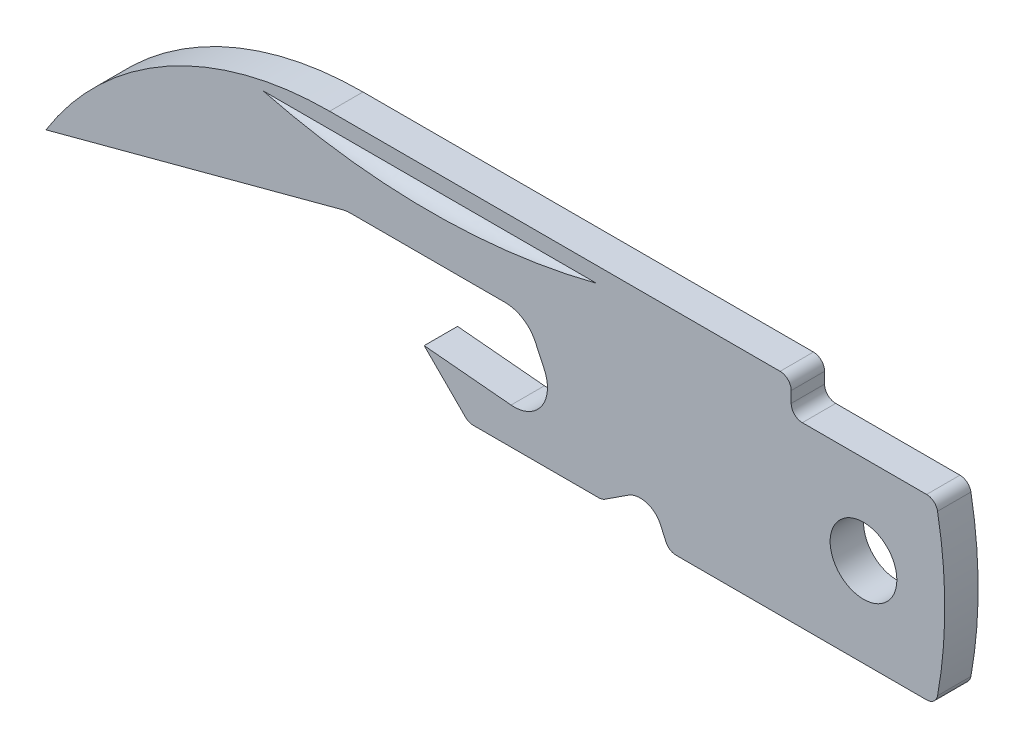
ISO-10303-21;
HEADER;
FILE_DESCRIPTION(('STEP AP214'),'2;1');
FILE_NAME('part.step','',(''),(''),'','','');
FILE_SCHEMA(('AUTOMOTIVE_DESIGN { 1 0 10303 214 1 1 1 1 }'));
ENDSEC;
DATA;
#1=APPLICATION_CONTEXT('core data for automotive mechanical design processes');
#2=APPLICATION_PROTOCOL_DEFINITION('international standard','automotive_design',2000,#1);
#3=PRODUCT_CONTEXT('',#1,'mechanical');
#4=PRODUCT('Part','Part','',(#3));
#5=PRODUCT_RELATED_PRODUCT_CATEGORY('part','',(#4));
#6=PRODUCT_DEFINITION_FORMATION('','',#4);
#7=PRODUCT_DEFINITION_CONTEXT('part definition',#1,'design');
#8=PRODUCT_DEFINITION('design','',#6,#7);
#9=PRODUCT_DEFINITION_SHAPE('','',#8);
#10=(LENGTH_UNIT() NAMED_UNIT(*) SI_UNIT(.MILLI.,.METRE.));
#11=(NAMED_UNIT(*) PLANE_ANGLE_UNIT() SI_UNIT($,.RADIAN.));
#12=(NAMED_UNIT(*) SI_UNIT($,.STERADIAN.) SOLID_ANGLE_UNIT());
#13=UNCERTAINTY_MEASURE_WITH_UNIT(LENGTH_MEASURE(1.E-05),#10,'distance_accuracy_value','');
#14=(GEOMETRIC_REPRESENTATION_CONTEXT(3) GLOBAL_UNCERTAINTY_ASSIGNED_CONTEXT((#13)) GLOBAL_UNIT_ASSIGNED_CONTEXT((#10,
#11,#12)) REPRESENTATION_CONTEXT('',''));
#15=CARTESIAN_POINT('',(0.,0.,0.));
#16=DIRECTION('',(0.,0.,1.));
#17=DIRECTION('',(1.,0.,0.));
#18=AXIS2_PLACEMENT_3D('',#15,#16,#17);
#19=CARTESIAN_POINT('',(-16.3459179422654,0.,0.75));
#20=DIRECTION('',(0.,0.,-1.));
#21=DIRECTION('',(-1.,0.,0.));
#22=AXIS2_PLACEMENT_3D('',#19,#20,#21);
#23=PLANE('',#22);
#24=DIRECTION('',(-1.,0.,0.));
#25=VECTOR('',#24,1.);
#26=CARTESIAN_POINT('',(-27.,4.8,0.75));
#27=LINE('',#26,#25);
#28=CARTESIAN_POINT('',(-12.,4.8,0.75));
#29=VERTEX_POINT('',#28);
#30=CARTESIAN_POINT('',(-27.,4.8,0.75));
#31=VERTEX_POINT('',#30);
#32=EDGE_CURVE('E211',#29,#31,#27,.T.);
#33=ORIENTED_EDGE('',*,*,#32,.F.);
#34=CARTESIAN_POINT('',(-19.5,33.8473750965556,0.75));
#35=DIRECTION('',(0.,0.,1.));
#36=DIRECTION('',(-1.,0.,0.));
#37=AXIS2_PLACEMENT_3D('',#34,#35,#36);
#38=CIRCLE('',#37,30.);
#39=EDGE_CURVE('E219',#31,#29,#38,.T.);
#40=ORIENTED_EDGE('',*,*,#39,.F.);
#41=EDGE_LOOP('',(#33,#40));
#42=FACE_BOUND('',#41,.T.);
#43=DIRECTION('',(0.707106781186547,-0.707106781186548,0.));
#44=VECTOR('',#43,1.);
#45=CARTESIAN_POINT('',(-19.75,-1.5,0.75));
#46=LINE('',#45,#44);
#47=CARTESIAN_POINT('',(-19.75,-1.5,0.75));
#48=VERTEX_POINT('',#47);
#49=CARTESIAN_POINT('',(-17.8964466094067,-3.35355339059327,0.75));
#50=VERTEX_POINT('',#49);
#51=EDGE_CURVE('E237',#48,#50,#46,.T.);
#52=ORIENTED_EDGE('',*,*,#51,.T.);
#53=CARTESIAN_POINT('',(-17.5428932188135,-3.,0.75));
#54=DIRECTION('',(0.,0.,-1.));
#55=DIRECTION('',(-1.,0.,0.));
#56=AXIS2_PLACEMENT_3D('',#53,#54,#55);
#57=CIRCLE('',#56,0.5);
#58=CARTESIAN_POINT('',(-17.5428932188135,-3.5,0.75));
#59=VERTEX_POINT('',#58);
#60=EDGE_CURVE('E352',#50,#59,#57,.F.);
#61=ORIENTED_EDGE('',*,*,#60,.T.);
#62=DIRECTION('',(1.,0.,0.));
#63=VECTOR('',#62,1.);
#64=CARTESIAN_POINT('',(-17.75,-3.5,0.75));
#65=LINE('',#64,#63);
#66=CARTESIAN_POINT('',(-11.8984422579048,-3.5,0.75));
#67=VERTEX_POINT('',#66);
#68=EDGE_CURVE('E240',#59,#67,#65,.T.);
#69=ORIENTED_EDGE('',*,*,#68,.T.);
#70=CARTESIAN_POINT('',(-11.8984422579048,-3.,0.75));
#71=DIRECTION('',(0.,0.,-1.));
#72=DIRECTION('',(-1.,0.,0.));
#73=AXIS2_PLACEMENT_3D('',#70,#71,#72);
#74=CIRCLE('',#73,0.5);
#75=CARTESIAN_POINT('',(-11.6256056721861,-3.41899904235375,0.75));
#76=VERTEX_POINT('',#75);
#77=EDGE_CURVE('E342',#67,#76,#74,.F.);
#78=ORIENTED_EDGE('',*,*,#77,.T.);
#79=DIRECTION('',(0.837998084707486,0.545673171437432,0.));
#80=VECTOR('',#79,1.);
#81=CARTESIAN_POINT('',(-11.75,-3.5,0.75));
#82=LINE('',#81,#80);
#83=CARTESIAN_POINT('',(-10.5806227373016,-2.73854503824294,0.75));
#84=VERTEX_POINT('',#83);
#85=EDGE_CURVE('E243',#76,#84,#82,.T.);
#86=ORIENTED_EDGE('',*,*,#85,.T.);
#87=CARTESIAN_POINT('',(-10.0349495658642,-3.57654312295042,0.75));
#88=DIRECTION('',(0.,0.,-1.));
#89=DIRECTION('',(-1.,0.,0.));
#90=AXIS2_PLACEMENT_3D('',#87,#88,#89);
#91=CIRCLE('',#90,1.);
#92=CARTESIAN_POINT('',(-9.12213131396929,-3.16817706289217,0.75));
#93=VERTEX_POINT('',#92);
#94=EDGE_CURVE('E321',#84,#93,#91,.T.);
#95=ORIENTED_EDGE('',*,*,#94,.T.);
#96=DIRECTION('',(0.408366060058254,-0.91281825189492,0.));
#97=VECTOR('',#96,1.);
#98=CARTESIAN_POINT('',(-8.75,-4.,0.75));
#99=LINE('',#98,#97);
#100=CARTESIAN_POINT('',(-8.88233917077645,-3.70418303002913,0.75));
#101=VERTEX_POINT('',#100);
#102=EDGE_CURVE('E285',#93,#101,#99,.T.);
#103=ORIENTED_EDGE('',*,*,#102,.T.);
#104=CARTESIAN_POINT('',(-8.42593004482898,-3.5,0.75));
#105=DIRECTION('',(0.,0.,-1.));
#106=DIRECTION('',(-1.,0.,0.));
#107=AXIS2_PLACEMENT_3D('',#104,#105,#106);
#108=CIRCLE('',#107,0.5);
#109=CARTESIAN_POINT('',(-8.42593004482898,-4.,0.75));
#110=VERTEX_POINT('',#109);
#111=EDGE_CURVE('E344',#101,#110,#108,.F.);
#112=ORIENTED_EDGE('',*,*,#111,.T.);
#113=DIRECTION('',(1.,0.,0.));
#114=VECTOR('',#113,1.);
#115=CARTESIAN_POINT('',(3.25,-4.,0.75));
#116=LINE('',#115,#114);
#117=CARTESIAN_POINT('',(2.83740815098545,-4.,0.75));
#118=VERTEX_POINT('',#117);
#119=EDGE_CURVE('E288',#110,#118,#116,.T.);
#120=ORIENTED_EDGE('',*,*,#119,.T.);
#121=CARTESIAN_POINT('',(2.83740815098545,-3.5,0.75));
#122=DIRECTION('',(0.,0.,-1.));
#123=DIRECTION('',(-1.,0.,0.));
#124=AXIS2_PLACEMENT_3D('',#121,#122,#123);
#125=CIRCLE('',#124,0.5);
#126=CARTESIAN_POINT('',(3.32928830722265,-3.58974358974359,0.75));
#127=VERTEX_POINT('',#126);
#128=EDGE_CURVE('E346',#118,#127,#125,.F.);
#129=ORIENTED_EDGE('',*,*,#128,.T.);
#130=CARTESIAN_POINT('',(-16.3459179422654,0.,0.75));
#131=DIRECTION('',(0.,0.,1.));
#132=DIRECTION('',(-1.,0.,0.));
#133=AXIS2_PLACEMENT_3D('',#130,#131,#132);
#134=CIRCLE('',#133,20.);
#135=CARTESIAN_POINT('',(3.32928830722265,3.58974358974359,0.75));
#136=VERTEX_POINT('',#135);
#137=EDGE_CURVE('E291',#127,#136,#134,.T.);
#138=ORIENTED_EDGE('',*,*,#137,.T.);
#139=CARTESIAN_POINT('',(2.83740815098545,3.5,0.75));
#140=DIRECTION('',(0.,0.,-1.));
#141=DIRECTION('',(-1.,0.,0.));
#142=AXIS2_PLACEMENT_3D('',#139,#140,#141);
#143=CIRCLE('',#142,0.5);
#144=CARTESIAN_POINT('',(2.83740815098545,4.,0.75));
#145=VERTEX_POINT('',#144);
#146=EDGE_CURVE('E348',#136,#145,#143,.F.);
#147=ORIENTED_EDGE('',*,*,#146,.T.);
#148=DIRECTION('',(-1.,0.,0.));
#149=VECTOR('',#148,1.);
#150=CARTESIAN_POINT('',(-3.25,4.,0.75));
#151=LINE('',#150,#149);
#152=CARTESIAN_POINT('',(-2.75,4.,0.75));
#153=VERTEX_POINT('',#152);
#154=EDGE_CURVE('E294',#145,#153,#151,.T.);
#155=ORIENTED_EDGE('',*,*,#154,.T.);
#156=CARTESIAN_POINT('',(-2.75,4.5,0.75));
#157=DIRECTION('',(0.,0.,-1.));
#158=DIRECTION('',(-1.,0.,0.));
#159=AXIS2_PLACEMENT_3D('',#156,#157,#158);
#160=CIRCLE('',#159,0.5);
#161=CARTESIAN_POINT('',(-3.25,4.5,0.75));
#162=VERTEX_POINT('',#161);
#163=EDGE_CURVE('E384',#153,#162,#160,.T.);
#164=ORIENTED_EDGE('',*,*,#163,.T.);
#165=DIRECTION('',(0.,1.,0.));
#166=VECTOR('',#165,1.);
#167=CARTESIAN_POINT('',(-3.25,5.5,0.75));
#168=LINE('',#167,#166);
#169=CARTESIAN_POINT('',(-3.25,5.,0.75));
#170=VERTEX_POINT('',#169);
#171=EDGE_CURVE('E279',#162,#170,#168,.T.);
#172=ORIENTED_EDGE('',*,*,#171,.T.);
#173=CARTESIAN_POINT('',(-3.75,5.,0.75));
#174=DIRECTION('',(0.,0.,-1.));
#175=DIRECTION('',(-1.,0.,0.));
#176=AXIS2_PLACEMENT_3D('',#173,#174,#175);
#177=CIRCLE('',#176,0.5);
#178=CARTESIAN_POINT('',(-3.75,5.5,0.75));
#179=VERTEX_POINT('',#178);
#180=EDGE_CURVE('E350',#170,#179,#177,.F.);
#181=ORIENTED_EDGE('',*,*,#180,.T.);
#182=DIRECTION('',(-1.,0.,0.));
#183=VECTOR('',#182,1.);
#184=CARTESIAN_POINT('',(-13.,5.5,0.75));
#185=LINE('',#184,#183);
#186=CARTESIAN_POINT('',(-24.,5.5,0.75));
#187=VERTEX_POINT('',#186);
#188=EDGE_CURVE('E282',#179,#187,#185,.T.);
#189=ORIENTED_EDGE('',*,*,#188,.T.);
#190=CARTESIAN_POINT('',(-24.,-9.5,0.75));
#191=DIRECTION('',(0.,0.,1.));
#192=DIRECTION('',(1.,0.,0.));
#193=AXIS2_PLACEMENT_3D('',#190,#191,#192);
#194=CIRCLE('',#193,15.);
#195=CARTESIAN_POINT('',(-36.751078385768,-1.6,0.75));
#196=VERTEX_POINT('',#195);
#197=EDGE_CURVE('E224',#187,#196,#194,.T.);
#198=ORIENTED_EDGE('',*,*,#197,.T.);
#199=DIRECTION('',(0.966240063227901,0.25764343619301,0.));
#200=VECTOR('',#199,1.);
#201=CARTESIAN_POINT('',(-36.751078385768,-1.6,0.75));
#202=LINE('',#201,#200);
#203=CARTESIAN_POINT('',(-23.4399148136078,1.94936009484185,0.75));
#204=VERTEX_POINT('',#203);
#205=EDGE_CURVE('E226',#196,#204,#202,.T.);
#206=ORIENTED_EDGE('',*,*,#205,.T.);
#207=CARTESIAN_POINT('',(-23.0534496593183,0.499999999999998,0.75));
#208=DIRECTION('',(0.,0.,-1.));
#209=DIRECTION('',(-1.,0.,0.));
#210=AXIS2_PLACEMENT_3D('',#207,#208,#209);
#211=CIRCLE('',#210,1.5);
#212=CARTESIAN_POINT('',(-23.0534496593183,2.,0.75));
#213=VERTEX_POINT('',#212);
#214=EDGE_CURVE('E406',#204,#213,#211,.T.);
#215=ORIENTED_EDGE('',*,*,#214,.T.);
#216=DIRECTION('',(1.,0.,0.));
#217=VECTOR('',#216,1.);
#218=CARTESIAN_POINT('',(-23.25,2.,0.75));
#219=LINE('',#218,#217);
#220=CARTESIAN_POINT('',(-16.1081156381993,2.,0.75));
#221=VERTEX_POINT('',#220);
#222=EDGE_CURVE('E229',#213,#221,#219,.T.);
#223=ORIENTED_EDGE('',*,*,#222,.T.);
#224=CARTESIAN_POINT('',(-16.1081156381993,0.499999999999998,0.75));
#225=DIRECTION('',(0.,0.,-1.));
#226=DIRECTION('',(-1.,0.,0.));
#227=AXIS2_PLACEMENT_3D('',#224,#225,#226);
#228=CIRCLE('',#227,1.5);
#229=CARTESIAN_POINT('',(-14.7471497283986,1.13069151917592,0.75));
#230=VERTEX_POINT('',#229);
#231=EDGE_CURVE('E11',#221,#230,#228,.T.);
#232=ORIENTED_EDGE('',*,*,#231,.T.);
#233=DIRECTION('',(0.420461012783947,-0.907310606533781,0.));
#234=VECTOR('',#233,1.);
#235=CARTESIAN_POINT('',(-15.15,2.,0.75));
#236=LINE('',#235,#234);
#237=CARTESIAN_POINT('',(-14.3454252084757,0.263812291973821,0.75));
#238=VERTEX_POINT('',#237);
#239=EDGE_CURVE('E232',#230,#238,#236,.T.);
#240=ORIENTED_EDGE('',*,*,#239,.T.);
#241=CARTESIAN_POINT('',(-15.7063911182763,-0.3668792272021,0.75));
#242=DIRECTION('',(0.,0.,-1.));
#243=DIRECTION('',(-1.,0.,0.));
#244=AXIS2_PLACEMENT_3D('',#241,#242,#243);
#245=CIRCLE('',#244,1.5);
#246=CARTESIAN_POINT('',(-15.8442665046019,-1.86052924572906,0.75));
#247=VERTEX_POINT('',#246);
#248=EDGE_CURVE('E402',#238,#247,#245,.T.);
#249=ORIENTED_EDGE('',*,*,#248,.T.);
#250=DIRECTION('',(-0.995766679017971,0.0919169242170434,0.));
#251=VECTOR('',#250,1.);
#252=CARTESIAN_POINT('',(-13.25,-2.1,0.75));
#253=LINE('',#252,#251);
#254=EDGE_CURVE('E235',#247,#48,#253,.T.);
#255=ORIENTED_EDGE('',*,*,#254,.T.);
#256=EDGE_LOOP('',(#52,#61,#69,#78,#86,#95,#103,#112,#120,#129,#138,#147,#155,#164,#172,#181,
#189,#198,#206,#215,#223,#232,#240,#249,#255));
#257=FACE_BOUND('',#256,.T.);
#258=CARTESIAN_POINT('',(0.,0.,0.75));
#259=DIRECTION('',(0.,0.,1.));
#260=DIRECTION('',(1.,0.,0.));
#261=AXIS2_PLACEMENT_3D('',#258,#259,#260);
#262=CIRCLE('',#261,1.5);
#263=CARTESIAN_POINT('',(1.5,0.,0.75));
#264=VERTEX_POINT('',#263);
#265=EDGE_CURVE('E273',#264,#264,#262,.T.);
#266=ORIENTED_EDGE('',*,*,#265,.F.);
#267=EDGE_LOOP('',(#266));
#268=FACE_BOUND('',#267,.T.);
#269=ADVANCED_FACE('F39',(#42,#257,#268),#23,.F.);
#270=CARTESIAN_POINT('',(-16.3459179422654,0.,-0.75));
#271=DIRECTION('',(0.,0.,-1.));
#272=DIRECTION('',(-1.,0.,0.));
#273=AXIS2_PLACEMENT_3D('',#270,#271,#272);
#274=PLANE('',#273);
#275=DIRECTION('',(1.,0.,0.));
#276=VECTOR('',#275,1.);
#277=CARTESIAN_POINT('',(-17.75,-3.5,-0.75));
#278=LINE('',#277,#276);
#279=CARTESIAN_POINT('',(-17.5428932188135,-3.5,-0.75));
#280=VERTEX_POINT('',#279);
#281=CARTESIAN_POINT('',(-11.8984422579048,-3.5,-0.75));
#282=VERTEX_POINT('',#281);
#283=EDGE_CURVE('E260',#280,#282,#278,.T.);
#284=ORIENTED_EDGE('',*,*,#283,.F.);
#285=CARTESIAN_POINT('',(-17.5428932188135,-3.,-0.75));
#286=DIRECTION('',(0.,0.,-1.));
#287=DIRECTION('',(-1.,0.,0.));
#288=AXIS2_PLACEMENT_3D('',#285,#286,#287);
#289=CIRCLE('',#288,0.5);
#290=CARTESIAN_POINT('',(-17.8964466094067,-3.35355339059327,-0.75));
#291=VERTEX_POINT('',#290);
#292=EDGE_CURVE('E338',#280,#291,#289,.T.);
#293=ORIENTED_EDGE('',*,*,#292,.T.);
#294=DIRECTION('',(0.707106781186547,-0.707106781186548,0.));
#295=VECTOR('',#294,1.);
#296=CARTESIAN_POINT('',(-19.75,-1.5,-0.75));
#297=LINE('',#296,#295);
#298=CARTESIAN_POINT('',(-19.75,-1.5,-0.75));
#299=VERTEX_POINT('',#298);
#300=EDGE_CURVE('E257',#299,#291,#297,.T.);
#301=ORIENTED_EDGE('',*,*,#300,.F.);
#302=DIRECTION('',(-0.995766679017971,0.0919169242170434,0.));
#303=VECTOR('',#302,1.);
#304=CARTESIAN_POINT('',(-13.25,-2.1,-0.75));
#305=LINE('',#304,#303);
#306=CARTESIAN_POINT('',(-15.8442665046019,-1.86052924572906,-0.75));
#307=VERTEX_POINT('',#306);
#308=EDGE_CURVE('E255',#307,#299,#305,.T.);
#309=ORIENTED_EDGE('',*,*,#308,.F.);
#310=CARTESIAN_POINT('',(-15.7063911182763,-0.3668792272021,-0.75));
#311=DIRECTION('',(0.,0.,-1.));
#312=DIRECTION('',(-1.,0.,0.));
#313=AXIS2_PLACEMENT_3D('',#310,#311,#312);
#314=CIRCLE('',#313,1.5);
#315=CARTESIAN_POINT('',(-14.3454252084757,0.263812291973821,-0.75));
#316=VERTEX_POINT('',#315);
#317=EDGE_CURVE('E400',#307,#316,#314,.F.);
#318=ORIENTED_EDGE('',*,*,#317,.T.);
#319=DIRECTION('',(0.420461012783947,-0.907310606533781,0.));
#320=VECTOR('',#319,1.);
#321=CARTESIAN_POINT('',(-15.15,2.,-0.75));
#322=LINE('',#321,#320);
#323=CARTESIAN_POINT('',(-14.7471497283986,1.13069151917592,-0.75));
#324=VERTEX_POINT('',#323);
#325=EDGE_CURVE('E252',#324,#316,#322,.T.);
#326=ORIENTED_EDGE('',*,*,#325,.F.);
#327=CARTESIAN_POINT('',(-16.1081156381993,0.499999999999998,-0.75));
#328=DIRECTION('',(0.,0.,-1.));
#329=DIRECTION('',(-1.,0.,0.));
#330=AXIS2_PLACEMENT_3D('',#327,#328,#329);
#331=CIRCLE('',#330,1.5);
#332=CARTESIAN_POINT('',(-16.1081156381993,2.,-0.75));
#333=VERTEX_POINT('',#332);
#334=EDGE_CURVE('E47',#324,#333,#331,.F.);
#335=ORIENTED_EDGE('',*,*,#334,.T.);
#336=DIRECTION('',(1.,0.,0.));
#337=VECTOR('',#336,1.);
#338=CARTESIAN_POINT('',(-23.25,2.,-0.75));
#339=LINE('',#338,#337);
#340=CARTESIAN_POINT('',(-23.0534496593183,2.,-0.75));
#341=VERTEX_POINT('',#340);
#342=EDGE_CURVE('E249',#341,#333,#339,.T.);
#343=ORIENTED_EDGE('',*,*,#342,.F.);
#344=CARTESIAN_POINT('',(-23.0534496593183,0.499999999999998,-0.75));
#345=DIRECTION('',(0.,0.,-1.));
#346=DIRECTION('',(-1.,0.,0.));
#347=AXIS2_PLACEMENT_3D('',#344,#345,#346);
#348=CIRCLE('',#347,1.5);
#349=CARTESIAN_POINT('',(-23.4399148136078,1.94936009484185,-0.75));
#350=VERTEX_POINT('',#349);
#351=EDGE_CURVE('E404',#341,#350,#348,.F.);
#352=ORIENTED_EDGE('',*,*,#351,.T.);
#353=DIRECTION('',(0.966240063227901,0.25764343619301,0.));
#354=VECTOR('',#353,1.);
#355=CARTESIAN_POINT('',(-36.751078385768,-1.6,-0.75));
#356=LINE('',#355,#354);
#357=CARTESIAN_POINT('',(-36.751078385768,-1.6,-0.75));
#358=VERTEX_POINT('',#357);
#359=EDGE_CURVE('E247',#358,#350,#356,.T.);
#360=ORIENTED_EDGE('',*,*,#359,.F.);
#361=CARTESIAN_POINT('',(-24.,-9.5,-0.75));
#362=DIRECTION('',(0.,0.,1.));
#363=DIRECTION('',(1.,0.,0.));
#364=AXIS2_PLACEMENT_3D('',#361,#362,#363);
#365=CIRCLE('',#364,15.);
#366=CARTESIAN_POINT('',(-24.,5.5,-0.75));
#367=VERTEX_POINT('',#366);
#368=EDGE_CURVE('E215',#367,#358,#365,.T.);
#369=ORIENTED_EDGE('',*,*,#368,.F.);
#370=DIRECTION('',(-1.,0.,0.));
#371=VECTOR('',#370,1.);
#372=CARTESIAN_POINT('',(-13.,5.5,-0.75));
#373=LINE('',#372,#371);
#374=CARTESIAN_POINT('',(-3.75,5.5,-0.75));
#375=VERTEX_POINT('',#374);
#376=EDGE_CURVE('E300',#375,#367,#373,.T.);
#377=ORIENTED_EDGE('',*,*,#376,.F.);
#378=CARTESIAN_POINT('',(-3.75,5.,-0.75));
#379=DIRECTION('',(0.,0.,-1.));
#380=DIRECTION('',(-1.,0.,0.));
#381=AXIS2_PLACEMENT_3D('',#378,#379,#380);
#382=CIRCLE('',#381,0.5);
#383=CARTESIAN_POINT('',(-3.25,5.,-0.75));
#384=VERTEX_POINT('',#383);
#385=EDGE_CURVE('E336',#375,#384,#382,.T.);
#386=ORIENTED_EDGE('',*,*,#385,.T.);
#387=DIRECTION('',(0.,1.,0.));
#388=VECTOR('',#387,1.);
#389=CARTESIAN_POINT('',(-3.25,5.5,-0.75));
#390=LINE('',#389,#388);
#391=CARTESIAN_POINT('',(-3.25,4.5,-0.75));
#392=VERTEX_POINT('',#391);
#393=EDGE_CURVE('E276',#392,#384,#390,.T.);
#394=ORIENTED_EDGE('',*,*,#393,.F.);
#395=CARTESIAN_POINT('',(-2.75,4.5,-0.75));
#396=DIRECTION('',(0.,0.,-1.));
#397=DIRECTION('',(-1.,0.,0.));
#398=AXIS2_PLACEMENT_3D('',#395,#396,#397);
#399=CIRCLE('',#398,0.5);
#400=CARTESIAN_POINT('',(-2.75,4.,-0.75));
#401=VERTEX_POINT('',#400);
#402=EDGE_CURVE('E382',#392,#401,#399,.F.);
#403=ORIENTED_EDGE('',*,*,#402,.T.);
#404=DIRECTION('',(-1.,0.,0.));
#405=VECTOR('',#404,1.);
#406=CARTESIAN_POINT('',(-3.25,4.,-0.75));
#407=LINE('',#406,#405);
#408=CARTESIAN_POINT('',(2.83740815098545,4.,-0.75));
#409=VERTEX_POINT('',#408);
#410=EDGE_CURVE('E283',#409,#401,#407,.T.);
#411=ORIENTED_EDGE('',*,*,#410,.F.);
#412=CARTESIAN_POINT('',(2.83740815098545,3.5,-0.75));
#413=DIRECTION('',(0.,0.,-1.));
#414=DIRECTION('',(-1.,0.,0.));
#415=AXIS2_PLACEMENT_3D('',#412,#413,#414);
#416=CIRCLE('',#415,0.5);
#417=CARTESIAN_POINT('',(3.32928830722265,3.58974358974359,-0.75));
#418=VERTEX_POINT('',#417);
#419=EDGE_CURVE('E334',#409,#418,#416,.T.);
#420=ORIENTED_EDGE('',*,*,#419,.T.);
#421=CARTESIAN_POINT('',(-16.3459179422654,0.,-0.75));
#422=DIRECTION('',(0.,0.,1.));
#423=DIRECTION('',(-1.,0.,0.));
#424=AXIS2_PLACEMENT_3D('',#421,#422,#423);
#425=CIRCLE('',#424,20.);
#426=CARTESIAN_POINT('',(3.32928830722265,-3.58974358974359,-0.75));
#427=VERTEX_POINT('',#426);
#428=EDGE_CURVE('E308',#427,#418,#425,.T.);
#429=ORIENTED_EDGE('',*,*,#428,.F.);
#430=CARTESIAN_POINT('',(2.83740815098545,-3.5,-0.75));
#431=DIRECTION('',(0.,0.,-1.));
#432=DIRECTION('',(-1.,0.,0.));
#433=AXIS2_PLACEMENT_3D('',#430,#431,#432);
#434=CIRCLE('',#433,0.5);
#435=CARTESIAN_POINT('',(2.83740815098545,-4.,-0.75));
#436=VERTEX_POINT('',#435);
#437=EDGE_CURVE('E332',#427,#436,#434,.T.);
#438=ORIENTED_EDGE('',*,*,#437,.T.);
#439=DIRECTION('',(1.,0.,0.));
#440=VECTOR('',#439,1.);
#441=CARTESIAN_POINT('',(3.25,-4.,-0.75));
#442=LINE('',#441,#440);
#443=CARTESIAN_POINT('',(-8.42593004482898,-4.,-0.75));
#444=VERTEX_POINT('',#443);
#445=EDGE_CURVE('E305',#444,#436,#442,.T.);
#446=ORIENTED_EDGE('',*,*,#445,.F.);
#447=CARTESIAN_POINT('',(-8.42593004482898,-3.5,-0.75));
#448=DIRECTION('',(0.,0.,-1.));
#449=DIRECTION('',(-1.,0.,0.));
#450=AXIS2_PLACEMENT_3D('',#447,#448,#449);
#451=CIRCLE('',#450,0.5);
#452=CARTESIAN_POINT('',(-8.88233917077645,-3.70418303002913,-0.75));
#453=VERTEX_POINT('',#452);
#454=EDGE_CURVE('E330',#444,#453,#451,.T.);
#455=ORIENTED_EDGE('',*,*,#454,.T.);
#456=DIRECTION('',(0.408366060058254,-0.91281825189492,0.));
#457=VECTOR('',#456,1.);
#458=CARTESIAN_POINT('',(-8.75,-4.,-0.75));
#459=LINE('',#458,#457);
#460=CARTESIAN_POINT('',(-9.12213131396929,-3.16817706289217,-0.75));
#461=VERTEX_POINT('',#460);
#462=EDGE_CURVE('E302',#461,#453,#459,.T.);
#463=ORIENTED_EDGE('',*,*,#462,.F.);
#464=CARTESIAN_POINT('',(-10.0349495658642,-3.57654312295042,-0.75));
#465=DIRECTION('',(0.,0.,-1.));
#466=DIRECTION('',(-1.,0.,0.));
#467=AXIS2_PLACEMENT_3D('',#464,#465,#466);
#468=CIRCLE('',#467,1.);
#469=CARTESIAN_POINT('',(-10.5806227373016,-2.73854503824294,-0.75));
#470=VERTEX_POINT('',#469);
#471=EDGE_CURVE('E318',#461,#470,#468,.F.);
#472=ORIENTED_EDGE('',*,*,#471,.T.);
#473=DIRECTION('',(0.837998084707486,0.545673171437432,0.));
#474=VECTOR('',#473,1.);
#475=CARTESIAN_POINT('',(-11.75,-3.5,-0.75));
#476=LINE('',#475,#474);
#477=CARTESIAN_POINT('',(-11.6256056721861,-3.41899904235375,-0.75));
#478=VERTEX_POINT('',#477);
#479=EDGE_CURVE('E227',#478,#470,#476,.T.);
#480=ORIENTED_EDGE('',*,*,#479,.F.);
#481=CARTESIAN_POINT('',(-11.8984422579048,-3.,-0.75));
#482=DIRECTION('',(0.,0.,-1.));
#483=DIRECTION('',(-1.,0.,0.));
#484=AXIS2_PLACEMENT_3D('',#481,#482,#483);
#485=CIRCLE('',#484,0.5);
#486=EDGE_CURVE('E328',#478,#282,#485,.T.);
#487=ORIENTED_EDGE('',*,*,#486,.T.);
#488=EDGE_LOOP('',(#284,#293,#301,#309,#318,#326,#335,#343,#352,#360,#369,#377,#386,#394,#403,
#411,#420,#429,#438,#446,#455,#463,#472,#480,#487));
#489=FACE_BOUND('',#488,.T.);
#490=CARTESIAN_POINT('',(0.,0.,-0.75));
#491=DIRECTION('',(0.,0.,1.));
#492=DIRECTION('',(1.,0.,0.));
#493=AXIS2_PLACEMENT_3D('',#490,#491,#492);
#494=CIRCLE('',#493,1.5);
#495=CARTESIAN_POINT('',(1.5,0.,-0.75));
#496=VERTEX_POINT('',#495);
#497=EDGE_CURVE('E272',#496,#496,#494,.T.);
#498=ORIENTED_EDGE('',*,*,#497,.T.);
#499=EDGE_LOOP('',(#498));
#500=FACE_BOUND('',#499,.T.);
#501=ADVANCED_FACE('F411',(#489,#500),#274,.T.);
#502=CARTESIAN_POINT('',(-3.25,5.5,0.75));
#503=DIRECTION('',(-1.,0.,0.));
#504=DIRECTION('',(0.,-1.,0.));
#505=AXIS2_PLACEMENT_3D('',#502,#503,#504);
#506=PLANE('',#505);
#507=ORIENTED_EDGE('',*,*,#393,.T.);
#508=DIRECTION('',(0.,0.,-1.));
#509=VECTOR('',#508,1.);
#510=CARTESIAN_POINT('',(-3.25,5.,0.75));
#511=LINE('',#510,#509);
#512=EDGE_CURVE('E360',#384,#170,#511,.F.);
#513=ORIENTED_EDGE('',*,*,#512,.T.);
#514=ORIENTED_EDGE('',*,*,#171,.F.);
#515=DIRECTION('',(0.,0.,-1.));
#516=VECTOR('',#515,1.);
#517=CARTESIAN_POINT('',(-3.25,4.5,-0.75));
#518=LINE('',#517,#516);
#519=EDGE_CURVE('E357',#162,#392,#518,.T.);
#520=ORIENTED_EDGE('',*,*,#519,.T.);
#521=EDGE_LOOP('',(#507,#513,#514,#520));
#522=FACE_BOUND('',#521,.T.);
#523=ADVANCED_FACE('F500',(#522),#506,.F.);
#524=CARTESIAN_POINT('',(-13.,5.5,0.75));
#525=DIRECTION('',(0.,-1.,0.));
#526=DIRECTION('',(0.,0.,-1.));
#527=AXIS2_PLACEMENT_3D('',#524,#525,#526);
#528=PLANE('',#527);
#529=ORIENTED_EDGE('',*,*,#188,.F.);
#530=DIRECTION('',(0.,0.,-1.));
#531=VECTOR('',#530,1.);
#532=CARTESIAN_POINT('',(-3.75,5.5,0.75));
#533=LINE('',#532,#531);
#534=EDGE_CURVE('E354',#179,#375,#533,.T.);
#535=ORIENTED_EDGE('',*,*,#534,.T.);
#536=ORIENTED_EDGE('',*,*,#376,.T.);
#537=DIRECTION('',(0.,0.,-1.));
#538=VECTOR('',#537,1.);
#539=CARTESIAN_POINT('',(-24.,5.5,0.75));
#540=LINE('',#539,#538);
#541=EDGE_CURVE('E269',#187,#367,#540,.T.);
#542=ORIENTED_EDGE('',*,*,#541,.F.);
#543=EDGE_LOOP('',(#529,#535,#536,#542));
#544=FACE_BOUND('',#543,.T.);
#545=ADVANCED_FACE('F509',(#544),#528,.F.);
#546=CARTESIAN_POINT('',(-8.75,-4.,0.75));
#547=DIRECTION('',(0.91281825189492,0.408366060058254,0.));
#548=DIRECTION('',(-0.408366060058254,0.912818251894921,0.));
#549=AXIS2_PLACEMENT_3D('',#546,#547,#548);
#550=PLANE('',#549);
#551=ORIENTED_EDGE('',*,*,#462,.T.);
#552=DIRECTION('',(0.,0.,-1.));
#553=VECTOR('',#552,1.);
#554=CARTESIAN_POINT('',(-8.88233917077645,-3.70418303002913,0.75));
#555=LINE('',#554,#553);
#556=EDGE_CURVE('E377',#453,#101,#555,.F.);
#557=ORIENTED_EDGE('',*,*,#556,.T.);
#558=ORIENTED_EDGE('',*,*,#102,.F.);
#559=DIRECTION('',(0.,0.,-1.));
#560=VECTOR('',#559,1.);
#561=CARTESIAN_POINT('',(-9.12213131396929,-3.16817706289217,-0.75));
#562=LINE('',#561,#560);
#563=EDGE_CURVE('E297',#93,#461,#562,.T.);
#564=ORIENTED_EDGE('',*,*,#563,.T.);
#565=EDGE_LOOP('',(#551,#557,#558,#564));
#566=FACE_BOUND('',#565,.T.);
#567=ADVANCED_FACE('F463',(#566),#550,.F.);
#568=CARTESIAN_POINT('',(3.25,-4.,0.75));
#569=DIRECTION('',(0.,1.,0.));
#570=DIRECTION('',(-1.,0.,0.));
#571=AXIS2_PLACEMENT_3D('',#568,#569,#570);
#572=PLANE('',#571);
#573=ORIENTED_EDGE('',*,*,#445,.T.);
#574=DIRECTION('',(0.,0.,-1.));
#575=VECTOR('',#574,1.);
#576=CARTESIAN_POINT('',(2.83740815098545,-4.,0.75));
#577=LINE('',#576,#575);
#578=EDGE_CURVE('E375',#436,#118,#577,.F.);
#579=ORIENTED_EDGE('',*,*,#578,.T.);
#580=ORIENTED_EDGE('',*,*,#119,.F.);
#581=DIRECTION('',(0.,0.,-1.));
#582=VECTOR('',#581,1.);
#583=CARTESIAN_POINT('',(-8.42593004482898,-4.,0.75));
#584=LINE('',#583,#582);
#585=EDGE_CURVE('E372',#110,#444,#584,.T.);
#586=ORIENTED_EDGE('',*,*,#585,.T.);
#587=EDGE_LOOP('',(#573,#579,#580,#586));
#588=FACE_BOUND('',#587,.T.);
#589=ADVANCED_FACE('F474',(#588),#572,.F.);
#590=CARTESIAN_POINT('',(-16.3459179422654,0.,0.75));
#591=DIRECTION('',(0.,0.,-1.));
#592=DIRECTION('',(-1.,0.,0.));
#593=AXIS2_PLACEMENT_3D('',#590,#591,#592);
#594=CYLINDRICAL_SURFACE('',#593,20.);
#595=ORIENTED_EDGE('',*,*,#428,.T.);
#596=DIRECTION('',(0.,0.,-1.));
#597=VECTOR('',#596,1.);
#598=CARTESIAN_POINT('',(3.32928830722266,3.58974358974359,0.75));
#599=LINE('',#598,#597);
#600=EDGE_CURVE('E370',#418,#136,#599,.F.);
#601=ORIENTED_EDGE('',*,*,#600,.T.);
#602=ORIENTED_EDGE('',*,*,#137,.F.);
#603=DIRECTION('',(0.,0.,-1.));
#604=VECTOR('',#603,1.);
#605=CARTESIAN_POINT('',(3.32928830722266,-3.58974358974359,0.75));
#606=LINE('',#605,#604);
#607=EDGE_CURVE('E367',#127,#427,#606,.T.);
#608=ORIENTED_EDGE('',*,*,#607,.T.);
#609=EDGE_LOOP('',(#595,#601,#602,#608));
#610=FACE_BOUND('',#609,.T.);
#611=ADVANCED_FACE('F482',(#610),#594,.T.);
#612=CARTESIAN_POINT('',(-3.25,4.,0.75));
#613=DIRECTION('',(0.,-1.,0.));
#614=DIRECTION('',(0.,0.,-1.));
#615=AXIS2_PLACEMENT_3D('',#612,#613,#614);
#616=PLANE('',#615);
#617=ORIENTED_EDGE('',*,*,#410,.T.);
#618=DIRECTION('',(0.,0.,-1.));
#619=VECTOR('',#618,1.);
#620=CARTESIAN_POINT('',(-2.75,4.,0.75));
#621=LINE('',#620,#619);
#622=EDGE_CURVE('E365',#401,#153,#621,.F.);
#623=ORIENTED_EDGE('',*,*,#622,.T.);
#624=ORIENTED_EDGE('',*,*,#154,.F.);
#625=DIRECTION('',(0.,0.,-1.));
#626=VECTOR('',#625,1.);
#627=CARTESIAN_POINT('',(2.83740815098545,4.,0.75));
#628=LINE('',#627,#626);
#629=EDGE_CURVE('E362',#145,#409,#628,.T.);
#630=ORIENTED_EDGE('',*,*,#629,.T.);
#631=EDGE_LOOP('',(#617,#623,#624,#630));
#632=FACE_BOUND('',#631,.T.);
#633=ADVANCED_FACE('F491',(#632),#616,.F.);
#634=CARTESIAN_POINT('',(0.,0.,0.75));
#635=DIRECTION('',(0.,0.,-1.));
#636=DIRECTION('',(-1.,0.,0.));
#637=AXIS2_PLACEMENT_3D('',#634,#635,#636);
#638=CYLINDRICAL_SURFACE('',#637,1.5);
#639=ORIENTED_EDGE('',*,*,#265,.T.);
#640=EDGE_LOOP('',(#639));
#641=FACE_BOUND('',#640,.T.);
#642=ORIENTED_EDGE('',*,*,#497,.F.);
#643=EDGE_LOOP('',(#642));
#644=FACE_BOUND('',#643,.T.);
#645=ADVANCED_FACE('F529',(#641,#644),#638,.F.);
#646=CARTESIAN_POINT('',(-24.,-9.5,0.75));
#647=DIRECTION('',(0.,0.,-1.));
#648=DIRECTION('',(-1.,0.,0.));
#649=AXIS2_PLACEMENT_3D('',#646,#647,#648);
#650=CYLINDRICAL_SURFACE('',#649,15.);
#651=ORIENTED_EDGE('',*,*,#368,.T.);
#652=DIRECTION('',(0.,0.,-1.));
#653=VECTOR('',#652,1.);
#654=CARTESIAN_POINT('',(-36.751078385768,-1.6,0.75));
#655=LINE('',#654,#653);
#656=EDGE_CURVE('E266',#196,#358,#655,.T.);
#657=ORIENTED_EDGE('',*,*,#656,.F.);
#658=ORIENTED_EDGE('',*,*,#197,.F.);
#659=ORIENTED_EDGE('',*,*,#541,.T.);
#660=EDGE_LOOP('',(#651,#657,#658,#659));
#661=FACE_BOUND('',#660,.T.);
#662=ADVANCED_FACE('F515',(#661),#650,.T.);
#663=CARTESIAN_POINT('',(-36.751078385768,-1.6,0.75));
#664=DIRECTION('',(-0.25764343619301,0.966240063227901,0.));
#665=DIRECTION('',(-0.966240063227901,-0.25764343619301,0.));
#666=AXIS2_PLACEMENT_3D('',#663,#664,#665);
#667=PLANE('',#666);
#668=ORIENTED_EDGE('',*,*,#359,.T.);
#669=DIRECTION('',(0.,0.,-1.));
#670=VECTOR('',#669,1.);
#671=CARTESIAN_POINT('',(-23.4399148136078,1.94936009484185,0.75));
#672=LINE('',#671,#670);
#673=EDGE_CURVE('E61',#350,#204,#672,.F.);
#674=ORIENTED_EDGE('',*,*,#673,.T.);
#675=ORIENTED_EDGE('',*,*,#205,.F.);
#676=ORIENTED_EDGE('',*,*,#656,.T.);
#677=EDGE_LOOP('',(#668,#674,#675,#676));
#678=FACE_BOUND('',#677,.T.);
#679=ADVANCED_FACE('F520',(#678),#667,.F.);
#680=CARTESIAN_POINT('',(-23.25,2.,0.75));
#681=DIRECTION('',(0.,1.,0.));
#682=DIRECTION('',(0.,0.,1.));
#683=AXIS2_PLACEMENT_3D('',#680,#681,#682);
#684=PLANE('',#683);
#685=ORIENTED_EDGE('',*,*,#222,.F.);
#686=DIRECTION('',(0.,0.,-1.));
#687=VECTOR('',#686,1.);
#688=CARTESIAN_POINT('',(-23.0534496593183,2.,-0.75));
#689=LINE('',#688,#687);
#690=EDGE_CURVE('E396',#213,#341,#689,.T.);
#691=ORIENTED_EDGE('',*,*,#690,.T.);
#692=ORIENTED_EDGE('',*,*,#342,.T.);
#693=DIRECTION('',(0.,0.,-1.));
#694=VECTOR('',#693,1.);
#695=CARTESIAN_POINT('',(-16.1081156381993,2.,0.75));
#696=LINE('',#695,#694);
#697=EDGE_CURVE('E394',#333,#221,#696,.F.);
#698=ORIENTED_EDGE('',*,*,#697,.T.);
#699=EDGE_LOOP('',(#685,#691,#692,#698));
#700=FACE_BOUND('',#699,.T.);
#701=ADVANCED_FACE('F418',(#700),#684,.F.);
#702=CARTESIAN_POINT('',(-15.15,2.,0.75));
#703=DIRECTION('',(0.907310606533781,0.420461012783947,0.));
#704=DIRECTION('',(-0.420461012783947,0.907310606533781,0.));
#705=AXIS2_PLACEMENT_3D('',#702,#703,#704);
#706=PLANE('',#705);
#707=ORIENTED_EDGE('',*,*,#325,.T.);
#708=DIRECTION('',(0.,0.,-1.));
#709=VECTOR('',#708,1.);
#710=CARTESIAN_POINT('',(-14.3454252084757,0.263812291973821,0.75));
#711=LINE('',#710,#709);
#712=EDGE_CURVE('E392',#316,#238,#711,.F.);
#713=ORIENTED_EDGE('',*,*,#712,.T.);
#714=ORIENTED_EDGE('',*,*,#239,.F.);
#715=DIRECTION('',(0.,0.,-1.));
#716=VECTOR('',#715,1.);
#717=CARTESIAN_POINT('',(-14.7471497283986,1.13069151917592,-0.75));
#718=LINE('',#717,#716);
#719=EDGE_CURVE('E389',#230,#324,#718,.T.);
#720=ORIENTED_EDGE('',*,*,#719,.T.);
#721=EDGE_LOOP('',(#707,#713,#714,#720));
#722=FACE_BOUND('',#721,.T.);
#723=ADVANCED_FACE('F425',(#722),#706,.F.);
#724=CARTESIAN_POINT('',(-13.25,-2.1,0.75));
#725=DIRECTION('',(-0.0919169242170433,-0.995766679017971,0.));
#726=DIRECTION('',(0.995766679017971,-0.0919169242170434,0.));
#727=AXIS2_PLACEMENT_3D('',#724,#725,#726);
#728=PLANE('',#727);
#729=ORIENTED_EDGE('',*,*,#254,.F.);
#730=DIRECTION('',(0.,0.,-1.));
#731=VECTOR('',#730,1.);
#732=CARTESIAN_POINT('',(-15.8442665046019,-1.86052924572906,-0.75));
#733=LINE('',#732,#731);
#734=EDGE_CURVE('E386',#247,#307,#733,.T.);
#735=ORIENTED_EDGE('',*,*,#734,.T.);
#736=ORIENTED_EDGE('',*,*,#308,.T.);
#737=DIRECTION('',(0.,0.,-1.));
#738=VECTOR('',#737,1.);
#739=CARTESIAN_POINT('',(-19.75,-1.5,0.75));
#740=LINE('',#739,#738);
#741=EDGE_CURVE('E245',#48,#299,#740,.T.);
#742=ORIENTED_EDGE('',*,*,#741,.F.);
#743=EDGE_LOOP('',(#729,#735,#736,#742));
#744=FACE_BOUND('',#743,.T.);
#745=ADVANCED_FACE('F433',(#744),#728,.F.);
#746=CARTESIAN_POINT('',(-19.75,-1.5,0.75));
#747=DIRECTION('',(0.707106781186548,0.707106781186547,0.));
#748=DIRECTION('',(-0.707106781186547,0.707106781186548,0.));
#749=AXIS2_PLACEMENT_3D('',#746,#747,#748);
#750=PLANE('',#749);
#751=ORIENTED_EDGE('',*,*,#300,.T.);
#752=DIRECTION('',(0.,0.,-1.));
#753=VECTOR('',#752,1.);
#754=CARTESIAN_POINT('',(-17.8964466094067,-3.35355339059327,0.75));
#755=LINE('',#754,#753);
#756=EDGE_CURVE('E340',#291,#50,#755,.F.);
#757=ORIENTED_EDGE('',*,*,#756,.T.);
#758=ORIENTED_EDGE('',*,*,#51,.F.);
#759=ORIENTED_EDGE('',*,*,#741,.T.);
#760=EDGE_LOOP('',(#751,#757,#758,#759));
#761=FACE_BOUND('',#760,.T.);
#762=ADVANCED_FACE('F438',(#761),#750,.F.);
#763=CARTESIAN_POINT('',(-17.75,-3.5,0.75));
#764=DIRECTION('',(0.,1.,0.));
#765=DIRECTION('',(0.,0.,1.));
#766=AXIS2_PLACEMENT_3D('',#763,#764,#765);
#767=PLANE('',#766);
#768=ORIENTED_EDGE('',*,*,#68,.F.);
#769=DIRECTION('',(0.,0.,-1.));
#770=VECTOR('',#769,1.);
#771=CARTESIAN_POINT('',(-17.5428932188135,-3.5,0.75));
#772=LINE('',#771,#770);
#773=EDGE_CURVE('E325',#59,#280,#772,.T.);
#774=ORIENTED_EDGE('',*,*,#773,.T.);
#775=ORIENTED_EDGE('',*,*,#283,.T.);
#776=DIRECTION('',(0.,0.,-1.));
#777=VECTOR('',#776,1.);
#778=CARTESIAN_POINT('',(-11.8984422579048,-3.5,0.75));
#779=LINE('',#778,#777);
#780=EDGE_CURVE('E323',#282,#67,#779,.F.);
#781=ORIENTED_EDGE('',*,*,#780,.T.);
#782=EDGE_LOOP('',(#768,#774,#775,#781));
#783=FACE_BOUND('',#782,.T.);
#784=ADVANCED_FACE('F446',(#783),#767,.F.);
#785=CARTESIAN_POINT('',(-11.75,-3.5,0.75));
#786=DIRECTION('',(-0.545673171437432,0.837998084707486,0.));
#787=DIRECTION('',(-0.837998084707486,-0.545673171437432,0.));
#788=AXIS2_PLACEMENT_3D('',#785,#786,#787);
#789=PLANE('',#788);
#790=ORIENTED_EDGE('',*,*,#85,.F.);
#791=DIRECTION('',(0.,0.,-1.));
#792=VECTOR('',#791,1.);
#793=CARTESIAN_POINT('',(-11.6256056721861,-3.41899904235375,0.75));
#794=LINE('',#793,#792);
#795=EDGE_CURVE('E379',#76,#478,#794,.T.);
#796=ORIENTED_EDGE('',*,*,#795,.T.);
#797=ORIENTED_EDGE('',*,*,#479,.T.);
#798=DIRECTION('',(0.,0.,-1.));
#799=VECTOR('',#798,1.);
#800=CARTESIAN_POINT('',(-10.5806227373016,-2.73854503824294,0.75));
#801=LINE('',#800,#799);
#802=EDGE_CURVE('E315',#470,#84,#801,.F.);
#803=ORIENTED_EDGE('',*,*,#802,.T.);
#804=EDGE_LOOP('',(#790,#796,#797,#803));
#805=FACE_BOUND('',#804,.T.);
#806=ADVANCED_FACE('F455',(#805),#789,.F.);
#807=CARTESIAN_POINT('',(-10.0349495658642,-3.57654312295042,0.75));
#808=DIRECTION('',(0.,0.,1.));
#809=DIRECTION('',(1.,0.,0.));
#810=AXIS2_PLACEMENT_3D('',#807,#808,#809);
#811=CYLINDRICAL_SURFACE('',#810,1.);
#812=ORIENTED_EDGE('',*,*,#94,.F.);
#813=ORIENTED_EDGE('',*,*,#802,.F.);
#814=ORIENTED_EDGE('',*,*,#471,.F.);
#815=ORIENTED_EDGE('',*,*,#563,.F.);
#816=EDGE_LOOP('',(#812,#813,#814,#815));
#817=FACE_BOUND('',#816,.T.);
#818=ADVANCED_FACE('F466',(#817),#811,.F.);
#819=CARTESIAN_POINT('',(-17.5428932188135,-3.,0.75));
#820=DIRECTION('',(0.,0.,-1.));
#821=DIRECTION('',(-1.,0.,0.));
#822=AXIS2_PLACEMENT_3D('',#819,#820,#821);
#823=CYLINDRICAL_SURFACE('',#822,0.5);
#824=ORIENTED_EDGE('',*,*,#60,.F.);
#825=ORIENTED_EDGE('',*,*,#756,.F.);
#826=ORIENTED_EDGE('',*,*,#292,.F.);
#827=ORIENTED_EDGE('',*,*,#773,.F.);
#828=EDGE_LOOP('',(#824,#825,#826,#827));
#829=FACE_BOUND('',#828,.T.);
#830=ADVANCED_FACE('F444',(#829),#823,.T.);
#831=CARTESIAN_POINT('',(-3.75,5.,0.75));
#832=DIRECTION('',(0.,0.,-1.));
#833=DIRECTION('',(-1.,0.,0.));
#834=AXIS2_PLACEMENT_3D('',#831,#832,#833);
#835=CYLINDRICAL_SURFACE('',#834,0.5);
#836=ORIENTED_EDGE('',*,*,#180,.F.);
#837=ORIENTED_EDGE('',*,*,#512,.F.);
#838=ORIENTED_EDGE('',*,*,#385,.F.);
#839=ORIENTED_EDGE('',*,*,#534,.F.);
#840=EDGE_LOOP('',(#836,#837,#838,#839));
#841=FACE_BOUND('',#840,.T.);
#842=ADVANCED_FACE('F504',(#841),#835,.T.);
#843=CARTESIAN_POINT('',(-2.75,4.5,0.75));
#844=DIRECTION('',(0.,0.,1.));
#845=DIRECTION('',(1.,0.,0.));
#846=AXIS2_PLACEMENT_3D('',#843,#844,#845);
#847=CYLINDRICAL_SURFACE('',#846,0.5);
#848=ORIENTED_EDGE('',*,*,#163,.F.);
#849=ORIENTED_EDGE('',*,*,#622,.F.);
#850=ORIENTED_EDGE('',*,*,#402,.F.);
#851=ORIENTED_EDGE('',*,*,#519,.F.);
#852=EDGE_LOOP('',(#848,#849,#850,#851));
#853=FACE_BOUND('',#852,.T.);
#854=ADVANCED_FACE('F495',(#853),#847,.F.);
#855=CARTESIAN_POINT('',(2.83740815098545,3.5,0.75));
#856=DIRECTION('',(0.,0.,-1.));
#857=DIRECTION('',(-1.,0.,0.));
#858=AXIS2_PLACEMENT_3D('',#855,#856,#857);
#859=CYLINDRICAL_SURFACE('',#858,0.5);
#860=ORIENTED_EDGE('',*,*,#146,.F.);
#861=ORIENTED_EDGE('',*,*,#600,.F.);
#862=ORIENTED_EDGE('',*,*,#419,.F.);
#863=ORIENTED_EDGE('',*,*,#629,.F.);
#864=EDGE_LOOP('',(#860,#861,#862,#863));
#865=FACE_BOUND('',#864,.T.);
#866=ADVANCED_FACE('F486',(#865),#859,.T.);
#867=CARTESIAN_POINT('',(2.83740815098545,-3.5,0.75));
#868=DIRECTION('',(0.,0.,-1.));
#869=DIRECTION('',(-1.,0.,0.));
#870=AXIS2_PLACEMENT_3D('',#867,#868,#869);
#871=CYLINDRICAL_SURFACE('',#870,0.5);
#872=ORIENTED_EDGE('',*,*,#128,.F.);
#873=ORIENTED_EDGE('',*,*,#578,.F.);
#874=ORIENTED_EDGE('',*,*,#437,.F.);
#875=ORIENTED_EDGE('',*,*,#607,.F.);
#876=EDGE_LOOP('',(#872,#873,#874,#875));
#877=FACE_BOUND('',#876,.T.);
#878=ADVANCED_FACE('F477',(#877),#871,.T.);
#879=CARTESIAN_POINT('',(-8.42593004482898,-3.5,0.75));
#880=DIRECTION('',(0.,0.,-1.));
#881=DIRECTION('',(-1.,0.,0.));
#882=AXIS2_PLACEMENT_3D('',#879,#880,#881);
#883=CYLINDRICAL_SURFACE('',#882,0.5);
#884=ORIENTED_EDGE('',*,*,#111,.F.);
#885=ORIENTED_EDGE('',*,*,#556,.F.);
#886=ORIENTED_EDGE('',*,*,#454,.F.);
#887=ORIENTED_EDGE('',*,*,#585,.F.);
#888=EDGE_LOOP('',(#884,#885,#886,#887));
#889=FACE_BOUND('',#888,.T.);
#890=ADVANCED_FACE('F469',(#889),#883,.T.);
#891=CARTESIAN_POINT('',(-11.8984422579048,-3.,0.75));
#892=DIRECTION('',(0.,0.,-1.));
#893=DIRECTION('',(-1.,0.,0.));
#894=AXIS2_PLACEMENT_3D('',#891,#892,#893);
#895=CYLINDRICAL_SURFACE('',#894,0.5);
#896=ORIENTED_EDGE('',*,*,#77,.F.);
#897=ORIENTED_EDGE('',*,*,#780,.F.);
#898=ORIENTED_EDGE('',*,*,#486,.F.);
#899=ORIENTED_EDGE('',*,*,#795,.F.);
#900=EDGE_LOOP('',(#896,#897,#898,#899));
#901=FACE_BOUND('',#900,.T.);
#902=ADVANCED_FACE('F452',(#901),#895,.T.);
#903=CARTESIAN_POINT('',(-15.7063911182763,-0.3668792272021,0.75));
#904=DIRECTION('',(0.,0.,1.));
#905=DIRECTION('',(1.,0.,0.));
#906=AXIS2_PLACEMENT_3D('',#903,#904,#905);
#907=CYLINDRICAL_SURFACE('',#906,1.5);
#908=ORIENTED_EDGE('',*,*,#248,.F.);
#909=ORIENTED_EDGE('',*,*,#712,.F.);
#910=ORIENTED_EDGE('',*,*,#317,.F.);
#911=ORIENTED_EDGE('',*,*,#734,.F.);
#912=EDGE_LOOP('',(#908,#909,#910,#911));
#913=FACE_BOUND('',#912,.T.);
#914=ADVANCED_FACE('F428',(#913),#907,.F.);
#915=CARTESIAN_POINT('',(-23.0534496593183,0.499999999999998,0.75));
#916=DIRECTION('',(0.,0.,1.));
#917=DIRECTION('',(1.,0.,0.));
#918=AXIS2_PLACEMENT_3D('',#915,#916,#917);
#919=CYLINDRICAL_SURFACE('',#918,1.5);
#920=ORIENTED_EDGE('',*,*,#214,.F.);
#921=ORIENTED_EDGE('',*,*,#673,.F.);
#922=ORIENTED_EDGE('',*,*,#351,.F.);
#923=ORIENTED_EDGE('',*,*,#690,.F.);
#924=EDGE_LOOP('',(#920,#921,#922,#923));
#925=FACE_BOUND('',#924,.T.);
#926=ADVANCED_FACE('F518',(#925),#919,.F.);
#927=CARTESIAN_POINT('',(-16.1081156381993,0.499999999999998,0.75));
#928=DIRECTION('',(0.,0.,1.));
#929=DIRECTION('',(1.,0.,0.));
#930=AXIS2_PLACEMENT_3D('',#927,#928,#929);
#931=CYLINDRICAL_SURFACE('',#930,1.5);
#932=ORIENTED_EDGE('',*,*,#231,.F.);
#933=ORIENTED_EDGE('',*,*,#697,.F.);
#934=ORIENTED_EDGE('',*,*,#334,.F.);
#935=ORIENTED_EDGE('',*,*,#719,.F.);
#936=EDGE_LOOP('',(#932,#933,#934,#935));
#937=FACE_BOUND('',#936,.T.);
#938=ADVANCED_FACE('F41',(#937),#931,.F.);
#939=CARTESIAN_POINT('',(-19.5,4.8,-28.2973750965556));
#940=DIRECTION('',(0.,-1.,0.));
#941=DIRECTION('',(0.,0.,1.));
#942=AXIS2_PLACEMENT_3D('',#939,#940,#941);
#943=CIRCLE('',#942,30.);
#944=TRIMMED_CURVE('',#943,(PARAMETER_VALUE(-0.252680255142079)),
(PARAMETER_VALUE(0.252680255142079)),.T.,.PARAMETER.);
#945=CARTESIAN_POINT('',(-19.5,4.8,0.750000000000001));
#946=DIRECTION('',(-1.,0.,0.));
#947=AXIS1_PLACEMENT('',#945,#946);
#948=SURFACE_OF_REVOLUTION('',#944,#947);
#949=ORIENTED_EDGE('',*,*,#39,.T.);
#950=CARTESIAN_POINT('',(-19.5,4.7999999999999,29.7973750965556));
#951=DIRECTION('',(0.,-1.,0.));
#952=DIRECTION('',(-1.,0.,0.));
#953=AXIS2_PLACEMENT_3D('',#950,#951,#952);
#954=CIRCLE('',#953,30.);
#955=EDGE_CURVE('E53',#31,#29,#954,.T.);
#956=ORIENTED_EDGE('',*,*,#955,.F.);
#957=EDGE_LOOP('',(#949,#956));
#958=FACE_BOUND('',#957,.T.);
#959=ADVANCED_FACE('F218',(#958),#948,.F.);
#960=CARTESIAN_POINT('',(-19.5,4.7999999999999,29.7973750965556));
#961=DIRECTION('',(0.,1.,0.));
#962=DIRECTION('',(-1.,0.,0.));
#963=AXIS2_PLACEMENT_3D('',#960,#961,#962);
#964=PLANE('',#963);
#965=ORIENTED_EDGE('',*,*,#955,.T.);
#966=ORIENTED_EDGE('',*,*,#32,.T.);
#967=EDGE_LOOP('',(#965,#966));
#968=FACE_BOUND('',#967,.T.);
#969=ADVANCED_FACE('F212',(#968),#964,.F.);
#970=CLOSED_SHELL('',(#269,#501,#523,#545,#567,#589,#611,#633,#645,#662,#679,#701,#723,#745,
#762,#784,#806,#818,#830,#842,#854,#866,#878,#890,#902,#914,#926,#938,#959,#969));
#971=MANIFOLD_SOLID_BREP('B2',#970);
#972=ADVANCED_BREP_SHAPE_REPRESENTATION('',(#18,#971),#14);
#973=SHAPE_DEFINITION_REPRESENTATION(#9,#972);
ENDSEC;
END-ISO-10303-21;
